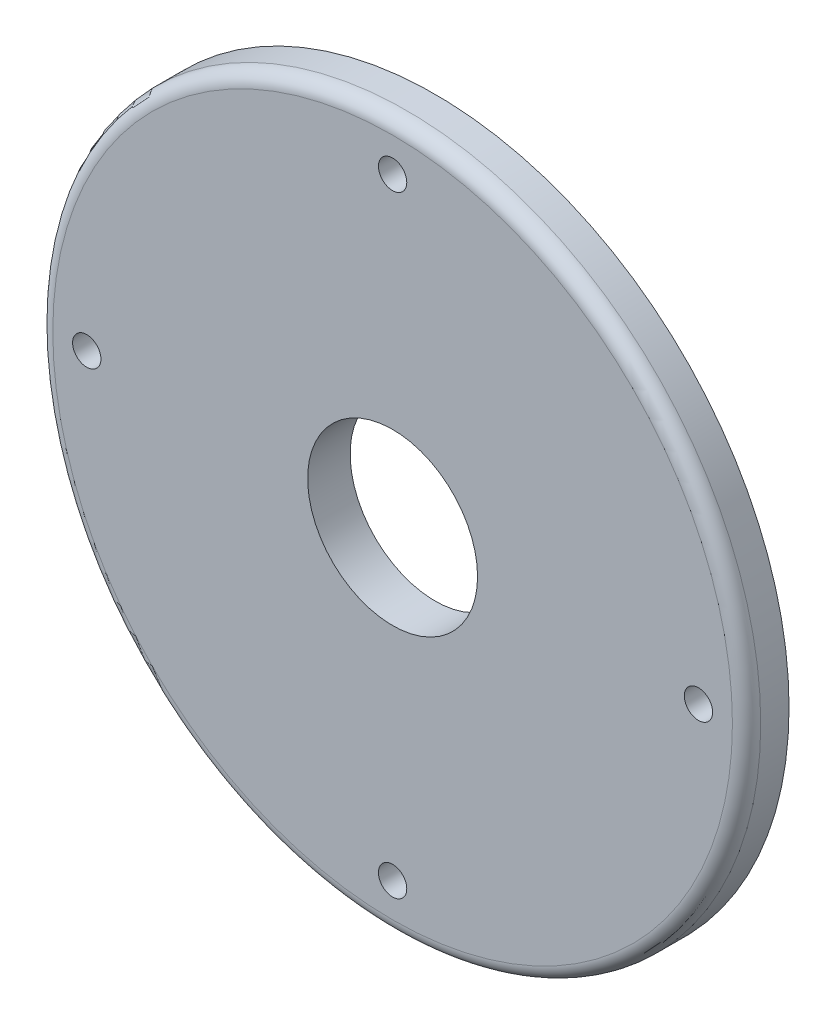
ISO-10303-21;
HEADER;
FILE_DESCRIPTION(('STEP AP214'),'2;1');
FILE_NAME('part.step','',(''),(''),'','','');
FILE_SCHEMA(('AUTOMOTIVE_DESIGN { 1 0 10303 214 1 1 1 1 }'));
ENDSEC;
DATA;
#1=APPLICATION_CONTEXT('core data for automotive mechanical design processes');
#2=APPLICATION_PROTOCOL_DEFINITION('international standard','automotive_design',2000,#1);
#3=PRODUCT_CONTEXT('',#1,'mechanical');
#4=PRODUCT('Part','Part','',(#3));
#5=PRODUCT_RELATED_PRODUCT_CATEGORY('part','',(#4));
#6=PRODUCT_DEFINITION_FORMATION('','',#4);
#7=PRODUCT_DEFINITION_CONTEXT('part definition',#1,'design');
#8=PRODUCT_DEFINITION('design','',#6,#7);
#9=PRODUCT_DEFINITION_SHAPE('','',#8);
#10=(LENGTH_UNIT() NAMED_UNIT(*) SI_UNIT(.MILLI.,.METRE.));
#11=(NAMED_UNIT(*) PLANE_ANGLE_UNIT() SI_UNIT($,.RADIAN.));
#12=(NAMED_UNIT(*) SI_UNIT($,.STERADIAN.) SOLID_ANGLE_UNIT());
#13=UNCERTAINTY_MEASURE_WITH_UNIT(LENGTH_MEASURE(1.E-05),#10,'distance_accuracy_value','');
#14=(GEOMETRIC_REPRESENTATION_CONTEXT(3) GLOBAL_UNCERTAINTY_ASSIGNED_CONTEXT((#13)) GLOBAL_UNIT_ASSIGNED_CONTEXT((#10,
#11,#12)) REPRESENTATION_CONTEXT('',''));
#15=CARTESIAN_POINT('',(0.,0.,0.));
#16=DIRECTION('',(0.,0.,1.));
#17=DIRECTION('',(1.,0.,0.));
#18=AXIS2_PLACEMENT_3D('',#15,#16,#17);
#19=CARTESIAN_POINT('',(678.383867879061,875.198049015447,1304.67784345282));
#20=DIRECTION('',(0.,0.,1.));
#21=DIRECTION('',(1.,0.,0.));
#22=AXIS2_PLACEMENT_3D('',#19,#20,#21);
#23=PLANE('',#22);
#24=CARTESIAN_POINT('',(678.383867879061,875.198049015447,1304.67784345282));
#25=DIRECTION('',(0.,0.,1.));
#26=DIRECTION('',(1.,0.,0.));
#27=AXIS2_PLACEMENT_3D('',#24,#25,#26);
#28=CIRCLE('',#27,24.000000000002);
#29=CARTESIAN_POINT('',(702.383867879063,875.198049015447,1304.67784345282));
#30=VERTEX_POINT('',#29);
#31=EDGE_CURVE('E46',#30,#30,#28,.T.);
#32=ORIENTED_EDGE('',*,*,#31,.T.);
#33=EDGE_LOOP('',(#32));
#34=FACE_BOUND('',#33,.T.);
#35=CARTESIAN_POINT('',(699.984934354459,875.198049015447,1304.67784345282));
#36=DIRECTION('',(0.,0.,1.));
#37=DIRECTION('',(1.,0.,0.));
#38=AXIS2_PLACEMENT_3D('',#35,#36,#37);
#39=CIRCLE('',#38,0.999999999999945);
#40=CARTESIAN_POINT('',(700.984934354459,875.198049015447,1304.67784345282));
#41=VERTEX_POINT('',#40);
#42=EDGE_CURVE('E72',#41,#41,#39,.T.);
#43=ORIENTED_EDGE('',*,*,#42,.F.);
#44=EDGE_LOOP('',(#43));
#45=FACE_BOUND('',#44,.T.);
#46=CARTESIAN_POINT('',(678.383867879061,896.799115490845,1304.67784345282));
#47=DIRECTION('',(0.,0.,1.));
#48=DIRECTION('',(1.,0.,0.));
#49=AXIS2_PLACEMENT_3D('',#46,#47,#48);
#50=CIRCLE('',#49,1.00000000000005);
#51=CARTESIAN_POINT('',(679.383867879061,896.799115490845,1304.67784345282));
#52=VERTEX_POINT('',#51);
#53=EDGE_CURVE('E60',#52,#52,#50,.T.);
#54=ORIENTED_EDGE('',*,*,#53,.F.);
#55=EDGE_LOOP('',(#54));
#56=FACE_BOUND('',#55,.T.);
#57=CARTESIAN_POINT('',(678.383867879061,875.198049015447,1304.67784345282));
#58=DIRECTION('',(0.,0.,1.));
#59=DIRECTION('',(1.,0.,0.));
#60=AXIS2_PLACEMENT_3D('',#57,#58,#59);
#61=CIRCLE('',#60,5.99999999999999);
#62=CARTESIAN_POINT('',(684.383867879061,875.198049015447,1304.67784345282));
#63=VERTEX_POINT('',#62);
#64=EDGE_CURVE('E54',#63,#63,#61,.T.);
#65=ORIENTED_EDGE('',*,*,#64,.F.);
#66=EDGE_LOOP('',(#65));
#67=FACE_BOUND('',#66,.T.);
#68=CARTESIAN_POINT('',(678.383867879061,853.596982540049,1304.67784345282));
#69=DIRECTION('',(0.,0.,1.));
#70=DIRECTION('',(1.,0.,0.));
#71=AXIS2_PLACEMENT_3D('',#68,#69,#70);
#72=CIRCLE('',#71,0.999999999999945);
#73=CARTESIAN_POINT('',(679.383867879061,853.596982540049,1304.67784345282));
#74=VERTEX_POINT('',#73);
#75=EDGE_CURVE('E66',#74,#74,#72,.T.);
#76=ORIENTED_EDGE('',*,*,#75,.F.);
#77=EDGE_LOOP('',(#76));
#78=FACE_BOUND('',#77,.T.);
#79=CARTESIAN_POINT('',(656.782801403663,875.198049015447,1304.67784345282));
#80=DIRECTION('',(0.,0.,1.));
#81=DIRECTION('',(1.,0.,0.));
#82=AXIS2_PLACEMENT_3D('',#79,#80,#81);
#83=CIRCLE('',#82,0.999999999999945);
#84=CARTESIAN_POINT('',(657.782801403663,875.198049015447,1304.67784345282));
#85=VERTEX_POINT('',#84);
#86=EDGE_CURVE('E78',#85,#85,#83,.T.);
#87=ORIENTED_EDGE('',*,*,#86,.F.);
#88=EDGE_LOOP('',(#87));
#89=FACE_BOUND('',#88,.T.);
#90=ADVANCED_FACE('F39',(#34,#45,#56,#67,#78,#89),#23,.T.);
#91=CARTESIAN_POINT('',(678.383867879061,875.198049015447,1301.67784345282));
#92=DIRECTION('',(0.,0.,1.));
#93=DIRECTION('',(1.,0.,0.));
#94=AXIS2_PLACEMENT_3D('',#91,#92,#93);
#95=PLANE('',#94);
#96=CARTESIAN_POINT('',(678.383867879061,875.198049015447,1301.67784345282));
#97=DIRECTION('',(0.,0.,1.));
#98=DIRECTION('',(1.,0.,0.));
#99=AXIS2_PLACEMENT_3D('',#96,#97,#98);
#100=CIRCLE('',#99,25.000000000002);
#101=CARTESIAN_POINT('',(703.383867879063,875.198049015447,1301.67784345282));
#102=VERTEX_POINT('',#101);
#103=EDGE_CURVE('E50',#102,#102,#100,.T.);
#104=ORIENTED_EDGE('',*,*,#103,.F.);
#105=EDGE_LOOP('',(#104));
#106=FACE_BOUND('',#105,.T.);
#107=CARTESIAN_POINT('',(678.383867879061,875.198049015447,1301.67784345282));
#108=DIRECTION('',(0.,0.,1.));
#109=DIRECTION('',(1.,0.,0.));
#110=AXIS2_PLACEMENT_3D('',#107,#108,#109);
#111=CIRCLE('',#110,5.99999999999999);
#112=CARTESIAN_POINT('',(684.383867879061,875.198049015447,1301.67784345282));
#113=VERTEX_POINT('',#112);
#114=EDGE_CURVE('E57',#113,#113,#111,.T.);
#115=ORIENTED_EDGE('',*,*,#114,.T.);
#116=EDGE_LOOP('',(#115));
#117=FACE_BOUND('',#116,.T.);
#118=CARTESIAN_POINT('',(678.383867879061,896.799115490845,1301.67784345282));
#119=DIRECTION('',(0.,0.,1.));
#120=DIRECTION('',(1.,0.,0.));
#121=AXIS2_PLACEMENT_3D('',#118,#119,#120);
#122=CIRCLE('',#121,1.00000000000005);
#123=CARTESIAN_POINT('',(679.383867879061,896.799115490845,1301.67784345282));
#124=VERTEX_POINT('',#123);
#125=EDGE_CURVE('E63',#124,#124,#122,.T.);
#126=ORIENTED_EDGE('',*,*,#125,.T.);
#127=EDGE_LOOP('',(#126));
#128=FACE_BOUND('',#127,.T.);
#129=CARTESIAN_POINT('',(678.383867879061,853.596982540049,1301.67784345282));
#130=DIRECTION('',(0.,0.,1.));
#131=DIRECTION('',(1.,0.,0.));
#132=AXIS2_PLACEMENT_3D('',#129,#130,#131);
#133=CIRCLE('',#132,0.999999999999945);
#134=CARTESIAN_POINT('',(679.383867879061,853.596982540049,1301.67784345282));
#135=VERTEX_POINT('',#134);
#136=EDGE_CURVE('E69',#135,#135,#133,.T.);
#137=ORIENTED_EDGE('',*,*,#136,.T.);
#138=EDGE_LOOP('',(#137));
#139=FACE_BOUND('',#138,.T.);
#140=CARTESIAN_POINT('',(699.984934354459,875.198049015447,1301.67784345282));
#141=DIRECTION('',(0.,0.,1.));
#142=DIRECTION('',(1.,0.,0.));
#143=AXIS2_PLACEMENT_3D('',#140,#141,#142);
#144=CIRCLE('',#143,0.999999999999945);
#145=CARTESIAN_POINT('',(700.984934354459,875.198049015447,1301.67784345282));
#146=VERTEX_POINT('',#145);
#147=EDGE_CURVE('E75',#146,#146,#144,.T.);
#148=ORIENTED_EDGE('',*,*,#147,.T.);
#149=EDGE_LOOP('',(#148));
#150=FACE_BOUND('',#149,.T.);
#151=CARTESIAN_POINT('',(656.782801403663,875.198049015447,1301.67784345282));
#152=DIRECTION('',(0.,0.,1.));
#153=DIRECTION('',(1.,0.,0.));
#154=AXIS2_PLACEMENT_3D('',#151,#152,#153);
#155=CIRCLE('',#154,0.999999999999945);
#156=CARTESIAN_POINT('',(657.782801403663,875.198049015447,1301.67784345282));
#157=VERTEX_POINT('',#156);
#158=EDGE_CURVE('E81',#157,#157,#155,.T.);
#159=ORIENTED_EDGE('',*,*,#158,.T.);
#160=EDGE_LOOP('',(#159));
#161=FACE_BOUND('',#160,.T.);
#162=ADVANCED_FACE('F91',(#106,#117,#128,#139,#150,#161),#95,.F.);
#163=CARTESIAN_POINT('',(678.383867879061,875.198049015447,1304.67784345282));
#164=DIRECTION('',(0.,0.,-1.));
#165=DIRECTION('',(-1.,0.,0.));
#166=AXIS2_PLACEMENT_3D('',#163,#164,#165);
#167=CYLINDRICAL_SURFACE('',#166,25.000000000002);
#168=CARTESIAN_POINT('',(678.383867879061,875.198049015447,1303.67784345282));
#169=DIRECTION('',(0.,0.,1.));
#170=DIRECTION('',(1.,0.,0.));
#171=AXIS2_PLACEMENT_3D('',#168,#169,#170);
#172=CIRCLE('',#171,25.000000000002);
#173=CARTESIAN_POINT('',(703.383867879063,875.198049015447,1303.67784345282));
#174=VERTEX_POINT('',#173);
#175=EDGE_CURVE('E10',#174,#174,#172,.F.);
#176=ORIENTED_EDGE('',*,*,#175,.T.);
#177=EDGE_LOOP('',(#176));
#178=FACE_BOUND('',#177,.T.);
#179=ORIENTED_EDGE('',*,*,#103,.T.);
#180=EDGE_LOOP('',(#179));
#181=FACE_BOUND('',#180,.T.);
#182=ADVANCED_FACE('F98',(#178,#181),#167,.T.);
#183=CARTESIAN_POINT('',(678.383867879061,875.198049015447,1304.67784345282));
#184=DIRECTION('',(0.,0.,-1.));
#185=DIRECTION('',(-1.,0.,0.));
#186=AXIS2_PLACEMENT_3D('',#183,#184,#185);
#187=CYLINDRICAL_SURFACE('',#186,5.99999999999999);
#188=ORIENTED_EDGE('',*,*,#64,.T.);
#189=EDGE_LOOP('',(#188));
#190=FACE_BOUND('',#189,.T.);
#191=ORIENTED_EDGE('',*,*,#114,.F.);
#192=EDGE_LOOP('',(#191));
#193=FACE_BOUND('',#192,.T.);
#194=ADVANCED_FACE('F103',(#190,#193),#187,.F.);
#195=CARTESIAN_POINT('',(678.383867879061,896.799115490845,1304.67784345282));
#196=DIRECTION('',(0.,0.,-1.));
#197=DIRECTION('',(-1.,0.,0.));
#198=AXIS2_PLACEMENT_3D('',#195,#196,#197);
#199=CYLINDRICAL_SURFACE('',#198,1.00000000000005);
#200=ORIENTED_EDGE('',*,*,#53,.T.);
#201=EDGE_LOOP('',(#200));
#202=FACE_BOUND('',#201,.T.);
#203=ORIENTED_EDGE('',*,*,#125,.F.);
#204=EDGE_LOOP('',(#203));
#205=FACE_BOUND('',#204,.T.);
#206=ADVANCED_FACE('F109',(#202,#205),#199,.F.);
#207=CARTESIAN_POINT('',(678.383867879061,853.596982540049,1304.67784345282));
#208=DIRECTION('',(0.,0.,-1.));
#209=DIRECTION('',(-1.,0.,0.));
#210=AXIS2_PLACEMENT_3D('',#207,#208,#209);
#211=CYLINDRICAL_SURFACE('',#210,0.999999999999945);
#212=ORIENTED_EDGE('',*,*,#75,.T.);
#213=EDGE_LOOP('',(#212));
#214=FACE_BOUND('',#213,.T.);
#215=ORIENTED_EDGE('',*,*,#136,.F.);
#216=EDGE_LOOP('',(#215));
#217=FACE_BOUND('',#216,.T.);
#218=ADVANCED_FACE('F129',(#214,#217),#211,.F.);
#219=CARTESIAN_POINT('',(699.984934354459,875.198049015447,1304.67784345282));
#220=DIRECTION('',(0.,0.,-1.));
#221=DIRECTION('',(-1.,0.,0.));
#222=AXIS2_PLACEMENT_3D('',#219,#220,#221);
#223=CYLINDRICAL_SURFACE('',#222,0.999999999999945);
#224=ORIENTED_EDGE('',*,*,#42,.T.);
#225=EDGE_LOOP('',(#224));
#226=FACE_BOUND('',#225,.T.);
#227=ORIENTED_EDGE('',*,*,#147,.F.);
#228=EDGE_LOOP('',(#227));
#229=FACE_BOUND('',#228,.T.);
#230=ADVANCED_FACE('F123',(#226,#229),#223,.F.);
#231=CARTESIAN_POINT('',(656.782801403663,875.198049015447,1304.67784345282));
#232=DIRECTION('',(0.,0.,-1.));
#233=DIRECTION('',(-1.,0.,0.));
#234=AXIS2_PLACEMENT_3D('',#231,#232,#233);
#235=CYLINDRICAL_SURFACE('',#234,0.999999999999945);
#236=ORIENTED_EDGE('',*,*,#86,.T.);
#237=EDGE_LOOP('',(#236));
#238=FACE_BOUND('',#237,.T.);
#239=ORIENTED_EDGE('',*,*,#158,.F.);
#240=EDGE_LOOP('',(#239));
#241=FACE_BOUND('',#240,.T.);
#242=ADVANCED_FACE('F87',(#238,#241),#235,.F.);
#243=CARTESIAN_POINT('',(678.383867879061,875.198049015447,1303.67784345282));
#244=DIRECTION('',(0.,0.,1.));
#245=DIRECTION('',(1.,0.,0.));
#246=AXIS2_PLACEMENT_3D('',#243,#244,#245);
#247=TOROIDAL_SURFACE('',#246,24.000000000002,1.);
#248=ORIENTED_EDGE('',*,*,#175,.F.);
#249=EDGE_LOOP('',(#248));
#250=FACE_BOUND('',#249,.T.);
#251=ORIENTED_EDGE('',*,*,#31,.F.);
#252=EDGE_LOOP('',(#251));
#253=FACE_BOUND('',#252,.T.);
#254=ADVANCED_FACE('F41',(#250,#253),#247,.T.);
#255=CLOSED_SHELL('',(#90,#162,#182,#194,#206,#218,#230,#242,#254));
#256=MANIFOLD_SOLID_BREP('B2',#255);
#257=ADVANCED_BREP_SHAPE_REPRESENTATION('',(#18,#256),#14);
#258=SHAPE_DEFINITION_REPRESENTATION(#9,#257);
ENDSEC;
END-ISO-10303-21;
